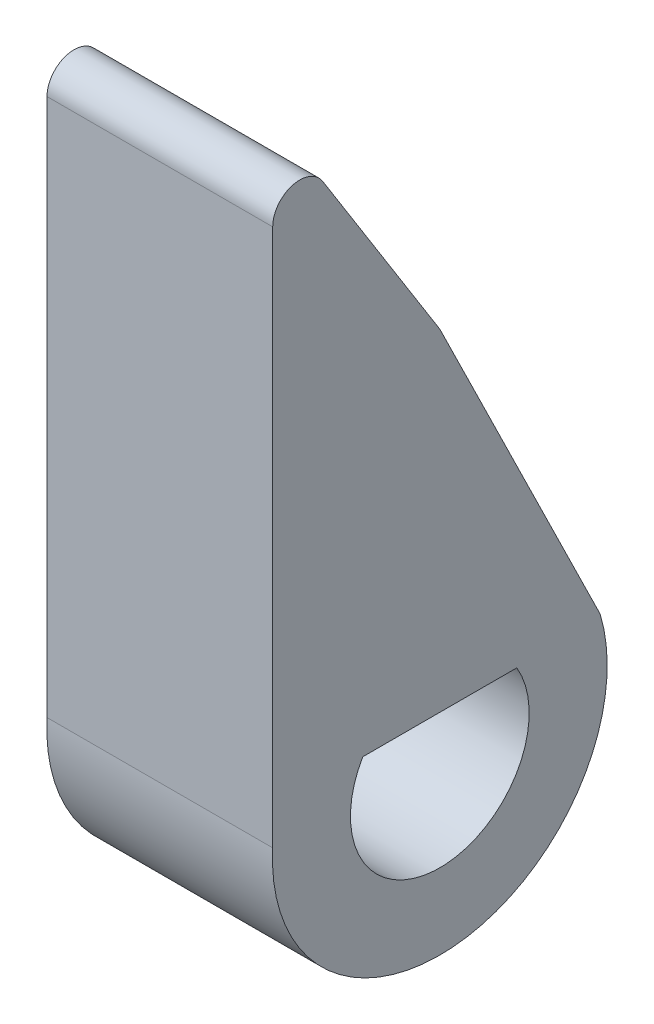
ISO-10303-21;
HEADER;
FILE_DESCRIPTION(('STEP AP214'),'2;1');
FILE_NAME('part.step','',(''),(''),'','','');
FILE_SCHEMA(('AUTOMOTIVE_DESIGN { 1 0 10303 214 1 1 1 1 }'));
ENDSEC;
DATA;
#1=APPLICATION_CONTEXT('core data for automotive mechanical design processes');
#2=APPLICATION_PROTOCOL_DEFINITION('international standard','automotive_design',2000,#1);
#3=PRODUCT_CONTEXT('',#1,'mechanical');
#4=PRODUCT('Part','Part','',(#3));
#5=PRODUCT_RELATED_PRODUCT_CATEGORY('part','',(#4));
#6=PRODUCT_DEFINITION_FORMATION('','',#4);
#7=PRODUCT_DEFINITION_CONTEXT('part definition',#1,'design');
#8=PRODUCT_DEFINITION('design','',#6,#7);
#9=PRODUCT_DEFINITION_SHAPE('','',#8);
#10=(LENGTH_UNIT() NAMED_UNIT(*) SI_UNIT(.MILLI.,.METRE.));
#11=(NAMED_UNIT(*) PLANE_ANGLE_UNIT() SI_UNIT($,.RADIAN.));
#12=(NAMED_UNIT(*) SI_UNIT($,.STERADIAN.) SOLID_ANGLE_UNIT());
#13=UNCERTAINTY_MEASURE_WITH_UNIT(LENGTH_MEASURE(1.E-05),#10,'distance_accuracy_value','');
#14=(GEOMETRIC_REPRESENTATION_CONTEXT(3) GLOBAL_UNCERTAINTY_ASSIGNED_CONTEXT((#13)) GLOBAL_UNIT_ASSIGNED_CONTEXT((#10,
#11,#12)) REPRESENTATION_CONTEXT('',''));
#15=CARTESIAN_POINT('',(0.,0.,0.));
#16=DIRECTION('',(0.,0.,1.));
#17=DIRECTION('',(1.,0.,0.));
#18=AXIS2_PLACEMENT_3D('',#15,#16,#17);
#19=CARTESIAN_POINT('',(2.5,27.5404275633658,53.6707737399797));
#20=DIRECTION('',(-1.,0.,0.));
#21=DIRECTION('',(0.,0.,1.));
#22=AXIS2_PLACEMENT_3D('',#19,#20,#21);
#23=CYLINDRICAL_SURFACE('',#22,1.85401136104677);
#24=CARTESIAN_POINT('',(2.5,27.5404275633658,53.6707737399797));
#25=DIRECTION('',(1.,0.,0.));
#26=DIRECTION('',(0.,0.,-1.));
#27=AXIS2_PLACEMENT_3D('',#24,#25,#26);
#28=CIRCLE('',#27,1.85401136104677);
#29=CARTESIAN_POINT('',(2.5,27.6417043733079,55.5220168722177));
#30=VERTEX_POINT('',#29);
#31=CARTESIAN_POINT('',(2.5,28.0710481182874,51.8943166046722));
#32=VERTEX_POINT('',#31);
#33=EDGE_CURVE('E119',#30,#32,#28,.T.);
#34=ORIENTED_EDGE('',*,*,#33,.F.);
#35=DIRECTION('',(1.,0.,0.));
#36=VECTOR('',#35,1.);
#37=CARTESIAN_POINT('',(-7.2406561259777,27.6417043733079,55.5220168722177));
#38=LINE('',#37,#36);
#39=CARTESIAN_POINT('',(0.,27.6417043733079,55.5220168722177));
#40=VERTEX_POINT('',#39);
#41=EDGE_CURVE('E131',#40,#30,#38,.T.);
#42=ORIENTED_EDGE('',*,*,#41,.F.);
#43=CARTESIAN_POINT('',(0.,27.5404275633658,53.6707737399797));
#44=DIRECTION('',(1.,0.,0.));
#45=DIRECTION('',(0.,0.,-1.));
#46=AXIS2_PLACEMENT_3D('',#43,#44,#45);
#47=CIRCLE('',#46,1.85401136104677);
#48=CARTESIAN_POINT('',(0.,28.0710481182874,51.8943166046722));
#49=VERTEX_POINT('',#48);
#50=EDGE_CURVE('E123',#40,#49,#47,.T.);
#51=ORIENTED_EDGE('',*,*,#50,.T.);
#52=DIRECTION('',(-1.,0.,0.));
#53=VECTOR('',#52,1.);
#54=CARTESIAN_POINT('',(2.5,28.0710481182874,51.8943166046722));
#55=LINE('',#54,#53);
#56=EDGE_CURVE('E106',#32,#49,#55,.T.);
#57=ORIENTED_EDGE('',*,*,#56,.F.);
#58=EDGE_LOOP('',(#34,#42,#51,#57));
#59=FACE_BOUND('',#58,.T.);
#60=ADVANCED_FACE('F41',(#59),#23,.T.);
#61=CARTESIAN_POINT('',(2.5,30.6404275633658,53.6707737399797));
#62=DIRECTION('',(1.,0.,0.));
#63=DIRECTION('',(0.,0.,-1.));
#64=AXIS2_PLACEMENT_3D('',#61,#62,#63);
#65=PLANE('',#64);
#66=DIRECTION('',(0.,0.846927219145,0.531708835239097));
#67=VECTOR('',#66,1.);
#68=CARTESIAN_POINT('',(2.5,34.6417043733079,55.5220168722177));
#69=LINE('',#68,#67);
#70=CARTESIAN_POINT('',(2.5,31.6929698516357,53.6707737399797));
#71=VERTEX_POINT('',#70);
#72=CARTESIAN_POINT('',(2.5,33.7591463847969,54.9679387064742));
#73=VERTEX_POINT('',#72);
#74=EDGE_CURVE('E128',#71,#73,#69,.T.);
#75=ORIENTED_EDGE('',*,*,#74,.T.);
#76=CARTESIAN_POINT('',(2.5,33.5996337342252,55.2220168722178));
#77=DIRECTION('',(1.,0.,0.));
#78=DIRECTION('',(0.,0.,-1.));
#79=AXIS2_PLACEMENT_3D('',#76,#77,#78);
#80=CIRCLE('',#79,0.3);
#81=CARTESIAN_POINT('',(2.5,33.5996337342252,55.5220168722177));
#82=VERTEX_POINT('',#81);
#83=EDGE_CURVE('E64',#73,#82,#80,.T.);
#84=ORIENTED_EDGE('',*,*,#83,.T.);
#85=DIRECTION('',(0.,-1.,0.));
#86=VECTOR('',#85,1.);
#87=CARTESIAN_POINT('',(2.5,27.6417043733079,55.5220168722177));
#88=LINE('',#87,#86);
#89=EDGE_CURVE('E248',#82,#30,#88,.T.);
#90=ORIENTED_EDGE('',*,*,#89,.T.);
#91=ORIENTED_EDGE('',*,*,#33,.T.);
#92=DIRECTION('',(0.,-0.897822209587444,-0.44035812695069));
#93=VECTOR('',#92,1.);
#94=CARTESIAN_POINT('',(2.5,31.6929698516357,53.6707737399797));
#95=LINE('',#94,#93);
#96=EDGE_CURVE('E112',#71,#32,#95,.T.);
#97=ORIENTED_EDGE('',*,*,#96,.F.);
#98=EDGE_LOOP('',(#75,#84,#90,#91,#97));
#99=FACE_BOUND('',#98,.T.);
#100=CARTESIAN_POINT('',(2.5,27.5141959960997,53.6707737399798));
#101=DIRECTION('',(1.,0.,0.));
#102=DIRECTION('',(0.,0.,-1.));
#103=AXIS2_PLACEMENT_3D('',#100,#101,#102);
#104=CIRCLE('',#103,0.989999999999993);
#105=CARTESIAN_POINT('',(2.5,28.0163959156241,54.5239415082585));
#106=VERTEX_POINT('',#105);
#107=CARTESIAN_POINT('',(2.5,28.0163959156241,52.8176059717011));
#108=VERTEX_POINT('',#107);
#109=EDGE_CURVE('E133',#106,#108,#104,.T.);
#110=ORIENTED_EDGE('',*,*,#109,.F.);
#111=DIRECTION('',(0.,0.,-1.));
#112=VECTOR('',#111,1.);
#113=CARTESIAN_POINT('',(2.5,28.0163959156241,54.6674353176535));
#114=LINE('',#113,#112);
#115=EDGE_CURVE('E139',#106,#108,#114,.T.);
#116=ORIENTED_EDGE('',*,*,#115,.T.);
#117=EDGE_LOOP('',(#110,#116));
#118=FACE_BOUND('',#117,.T.);
#119=ADVANCED_FACE('F195',(#99,#118),#65,.T.);
#120=CARTESIAN_POINT('',(0.,30.6404275633658,53.6707737399797));
#121=DIRECTION('',(1.,0.,0.));
#122=DIRECTION('',(0.,0.,-1.));
#123=AXIS2_PLACEMENT_3D('',#120,#121,#122);
#124=PLANE('',#123);
#125=DIRECTION('',(0.,0.,1.));
#126=VECTOR('',#125,1.);
#127=CARTESIAN_POINT('',(0.,28.2163959156241,54.5239415082585));
#128=LINE('',#127,#126);
#129=CARTESIAN_POINT('',(0.,28.2163959156241,52.7100369013919));
#130=VERTEX_POINT('',#129);
#131=CARTESIAN_POINT('',(0.,28.2163959156241,54.6315105785678));
#132=VERTEX_POINT('',#131);
#133=EDGE_CURVE('E148',#130,#132,#128,.T.);
#134=ORIENTED_EDGE('',*,*,#133,.T.);
#135=CARTESIAN_POINT('',(0.,27.5141959960997,53.6707737399798));
#136=DIRECTION('',(1.,0.,0.));
#137=DIRECTION('',(0.,0.,-1.));
#138=AXIS2_PLACEMENT_3D('',#135,#136,#137);
#139=CIRCLE('',#138,1.18999999999999);
#140=EDGE_CURVE('E151',#132,#130,#139,.T.);
#141=ORIENTED_EDGE('',*,*,#140,.T.);
#142=EDGE_LOOP('',(#134,#141));
#143=FACE_BOUND('',#142,.T.);
#144=DIRECTION('',(0.,1.,0.));
#145=VECTOR('',#144,1.);
#146=CARTESIAN_POINT('',(0.,27.6417043733079,55.5220168722177));
#147=LINE('',#146,#145);
#148=CARTESIAN_POINT('',(0.,33.5996337342252,55.5220168722177));
#149=VERTEX_POINT('',#148);
#150=EDGE_CURVE('E224',#40,#149,#147,.T.);
#151=ORIENTED_EDGE('',*,*,#150,.T.);
#152=CARTESIAN_POINT('',(0.,33.5996337342252,55.2220168722178));
#153=DIRECTION('',(1.,0.,0.));
#154=DIRECTION('',(0.,0.,-1.));
#155=AXIS2_PLACEMENT_3D('',#152,#153,#154);
#156=CIRCLE('',#155,0.3);
#157=CARTESIAN_POINT('',(0.,33.7591463847969,54.9679387064742));
#158=VERTEX_POINT('',#157);
#159=EDGE_CURVE('E11',#149,#158,#156,.F.);
#160=ORIENTED_EDGE('',*,*,#159,.T.);
#161=DIRECTION('',(0.,-0.846927219145,-0.531708835239097));
#162=VECTOR('',#161,1.);
#163=CARTESIAN_POINT('',(0.,34.6417043733079,55.5220168722177));
#164=LINE('',#163,#162);
#165=CARTESIAN_POINT('',(0.,31.6929698516357,53.6707737399797));
#166=VERTEX_POINT('',#165);
#167=EDGE_CURVE('E126',#158,#166,#164,.T.);
#168=ORIENTED_EDGE('',*,*,#167,.T.);
#169=DIRECTION('',(0.,-0.897822209587444,-0.44035812695069));
#170=VECTOR('',#169,1.);
#171=CARTESIAN_POINT('',(0.,31.6929698516357,53.6707737399797));
#172=LINE('',#171,#170);
#173=EDGE_CURVE('E109',#166,#49,#172,.T.);
#174=ORIENTED_EDGE('',*,*,#173,.T.);
#175=ORIENTED_EDGE('',*,*,#50,.F.);
#176=EDGE_LOOP('',(#151,#160,#168,#174,#175));
#177=FACE_BOUND('',#176,.T.);
#178=ADVANCED_FACE('F122',(#143,#177),#124,.F.);
#179=CARTESIAN_POINT('',(0.,27.5141959960997,53.6707737399798));
#180=DIRECTION('',(1.,0.,0.));
#181=DIRECTION('',(0.,0.,-1.));
#182=AXIS2_PLACEMENT_3D('',#179,#180,#181);
#183=CYLINDRICAL_SURFACE('',#182,0.989999999999993);
#184=DIRECTION('',(1.,0.,0.));
#185=VECTOR('',#184,1.);
#186=CARTESIAN_POINT('',(0.,28.0163959156241,52.8176059717011));
#187=LINE('',#186,#185);
#188=CARTESIAN_POINT('',(0.2,28.0163959156241,52.8176059717011));
#189=VERTEX_POINT('',#188);
#190=EDGE_CURVE('E144',#108,#189,#187,.F.);
#191=ORIENTED_EDGE('',*,*,#190,.T.);
#192=CARTESIAN_POINT('',(0.2,27.5141959960997,53.6707737399798));
#193=DIRECTION('',(1.,0.,0.));
#194=DIRECTION('',(0.,0.,-1.));
#195=AXIS2_PLACEMENT_3D('',#192,#193,#194);
#196=CIRCLE('',#195,0.989999999999993);
#197=CARTESIAN_POINT('',(0.2,28.0163959156241,54.5239415082585));
#198=VERTEX_POINT('',#197);
#199=EDGE_CURVE('E155',#189,#198,#196,.F.);
#200=ORIENTED_EDGE('',*,*,#199,.T.);
#201=DIRECTION('',(1.,0.,0.));
#202=VECTOR('',#201,1.);
#203=CARTESIAN_POINT('',(0.,28.0163959156241,54.5239415082585));
#204=LINE('',#203,#202);
#205=EDGE_CURVE('E118',#198,#106,#204,.T.);
#206=ORIENTED_EDGE('',*,*,#205,.T.);
#207=ORIENTED_EDGE('',*,*,#109,.T.);
#208=EDGE_LOOP('',(#191,#200,#206,#207));
#209=FACE_BOUND('',#208,.T.);
#210=ADVANCED_FACE('F202',(#209),#183,.F.);
#211=CARTESIAN_POINT('',(-2.16703056943876,28.0163959156241,54.6674353176535));
#212=DIRECTION('',(0.,-1.,0.));
#213=DIRECTION('',(0.,0.,-1.));
#214=AXIS2_PLACEMENT_3D('',#211,#212,#213);
#215=PLANE('',#214);
#216=ORIENTED_EDGE('',*,*,#205,.F.);
#217=DIRECTION('',(0.,0.,1.));
#218=VECTOR('',#217,1.);
#219=CARTESIAN_POINT('',(0.2,28.0163959156241,52.8176059717011));
#220=LINE('',#219,#218);
#221=EDGE_CURVE('E159',#198,#189,#220,.F.);
#222=ORIENTED_EDGE('',*,*,#221,.T.);
#223=ORIENTED_EDGE('',*,*,#190,.F.);
#224=ORIENTED_EDGE('',*,*,#115,.F.);
#225=EDGE_LOOP('',(#216,#222,#223,#224));
#226=FACE_BOUND('',#225,.T.);
#227=ADVANCED_FACE('F192',(#226),#215,.T.);
#228=CARTESIAN_POINT('',(0.2,28.2163959156241,53.6707737399797));
#229=DIRECTION('',(0.,0.,-1.));
#230=DIRECTION('',(-1.,0.,0.));
#231=AXIS2_PLACEMENT_3D('',#228,#229,#230);
#232=CYLINDRICAL_SURFACE('',#231,0.2);
#233=CARTESIAN_POINT('',(0.2,28.0163959156241,52.8176059717011));
#234=CARTESIAN_POINT('',(0.189772357512643,28.0163827461637,52.8176147868145));
#235=CARTESIAN_POINT('',(0.179557025954626,28.0171794869231,52.8171579500498));
#236=CARTESIAN_POINT('',(0.159480506417387,28.0202851473706,52.8153843990222));
#237=CARTESIAN_POINT('',(0.149617944812023,28.0225873222219,52.8140715201828));
#238=CARTESIAN_POINT('',(0.130489650722654,28.0285950089652,52.8106578234832));
#239=CARTESIAN_POINT('',(0.121223351505569,28.0322991645486,52.8085577671755));
#240=CARTESIAN_POINT('',(0.103479486426053,28.0409500335728,52.8036773085589));
#241=CARTESIAN_POINT('',(0.095002629131713,28.0458978488133,52.8008963030311));
#242=CARTESIAN_POINT('',(0.0785594278675043,28.0571575069703,52.7946044427444));
#243=CARTESIAN_POINT('',(0.0706462909463444,28.0635291111987,52.791062010407));
#244=CARTESIAN_POINT('',(0.0559907466998367,28.0772478387994,52.7834875743008));
#245=CARTESIAN_POINT('',(0.0492486860461361,28.0845952499059,52.7794554261605));
#246=CARTESIAN_POINT('',(0.036245786194352,28.1010371646158,52.7704995155165));
#247=CARTESIAN_POINT('',(0.0301494236702358,28.1102352921937,52.7655272495045));
#248=CARTESIAN_POINT('',(0.0195929108946618,28.1293738070536,52.7552723392696));
#249=CARTESIAN_POINT('',(0.0151340746689806,28.1393147827667,52.7499894497143));
#250=CARTESIAN_POINT('',(0.00785203697195295,28.1598336807001,52.7391822273171));
#251=CARTESIAN_POINT('',(0.00505106880596439,28.1704182498175,52.7336556357393));
#252=CARTESIAN_POINT('',(0.00121312094263996,28.1918603704444,52.7225601247676));
#253=CARTESIAN_POINT('',(0.000172406162618362,28.2027172942056,52.7169913202483));
#254=CARTESIAN_POINT('',(6.55167424093648E-06,28.2145249157657,52.7109872234583));
#255=CARTESIAN_POINT('',(-1.42508036722267E-08,28.2154604009842,52.710511891717));
#256=CARTESIAN_POINT('',(0.,28.2163959156241,52.7100369013919));
#257=B_SPLINE_CURVE_WITH_KNOTS('',3,(#233,#234,#235,#236,#237,#238,#239,#240,#241,#242,#243,
#244,#245,#246,#247,#248,#249,#250,#251,#252,#253,#254,#255,#256),.UNSPECIFIED.,.F.,.F.,(4,2,2,
2,2,2,2,2,2,2,2,4),(0.,0.0306224208694961,0.0611085747210697,0.0915653106350277,
0.122049124886549,0.154198674296258,0.186357724720407,0.222521484699059,0.258714201046618,
0.295381895067916,0.331971685824275,0.335119613660454),.UNSPECIFIED.);
#258=EDGE_CURVE('E163',#189,#130,#257,.T.);
#259=ORIENTED_EDGE('',*,*,#258,.F.);
#260=ORIENTED_EDGE('',*,*,#221,.F.);
#261=CARTESIAN_POINT('',(0.2,28.0163959156241,54.5239415082585));
#262=CARTESIAN_POINT('',(0.189772357512643,28.0163827461637,54.5239326931452));
#263=CARTESIAN_POINT('',(0.179557025954626,28.0171794869231,54.5243895299098));
#264=CARTESIAN_POINT('',(0.159480506417387,28.0202851473706,54.5261630809375));
#265=CARTESIAN_POINT('',(0.149617944812023,28.0225873222219,54.5274759597768));
#266=CARTESIAN_POINT('',(0.130489650722654,28.0285950089652,54.5308896564764));
#267=CARTESIAN_POINT('',(0.12122335150557,28.0322991645486,54.5329897127841));
#268=CARTESIAN_POINT('',(0.103479486426054,28.0409500335728,54.5378701714007));
#269=CARTESIAN_POINT('',(0.0950026291317135,28.0458978488133,54.5406511769286));
#270=CARTESIAN_POINT('',(0.0785594278675042,28.0571575069703,54.5469430372153));
#271=CARTESIAN_POINT('',(0.0706462909463443,28.0635291111987,54.5504854695526));
#272=CARTESIAN_POINT('',(0.0559907466998367,28.0772478387994,54.5580599056588));
#273=CARTESIAN_POINT('',(0.0492486860461361,28.0845952499059,54.5620920537992));
#274=CARTESIAN_POINT('',(0.036245786194352,28.1010371646158,54.5710479644432));
#275=CARTESIAN_POINT('',(0.0301494236702358,28.1102352921937,54.5760202304552));
#276=CARTESIAN_POINT('',(0.0195929108946617,28.1293738070536,54.5862751406901));
#277=CARTESIAN_POINT('',(0.0151340746689804,28.1393147827667,54.5915580302454));
#278=CARTESIAN_POINT('',(0.00785203697195153,28.1598336807001,54.6023652526425));
#279=CARTESIAN_POINT('',(0.00505106880596251,28.1704182498175,54.6078918442204));
#280=CARTESIAN_POINT('',(0.00121312094263952,28.1918603704444,54.6189873551921));
#281=CARTESIAN_POINT('',(0.000172406162618332,28.2027172942056,54.6245561597114));
#282=CARTESIAN_POINT('',(6.55167424093349E-06,28.2145249157657,54.6305602565014));
#283=CARTESIAN_POINT('',(-1.42508036753759E-08,28.2154604009842,54.6310355882426));
#284=CARTESIAN_POINT('',(0.,28.2163959156241,54.6315105785678));
#285=B_SPLINE_CURVE_WITH_KNOTS('',3,(#261,#262,#263,#264,#265,#266,#267,#268,#269,#270,#271,
#272,#273,#274,#275,#276,#277,#278,#279,#280,#281,#282,#283,#284),.UNSPECIFIED.,.F.,.F.,(4,2,2,
2,2,2,2,2,2,2,2,4),(0.,0.0306224208694961,0.0611085747210697,0.0915653106350264,
0.122049124886549,0.154198674296257,0.186357724720407,0.222521484699058,0.258714201046618,
0.295381895067931,0.331971685824274,0.335119613660454),.UNSPECIFIED.);
#286=EDGE_CURVE('E171',#132,#198,#285,.F.);
#287=ORIENTED_EDGE('',*,*,#286,.F.);
#288=ORIENTED_EDGE('',*,*,#133,.F.);
#289=EDGE_LOOP('',(#259,#260,#287,#288));
#290=FACE_BOUND('',#289,.T.);
#291=ADVANCED_FACE('F177',(#290),#232,.T.);
#292=CARTESIAN_POINT('',(0.2,27.5141959960997,53.6707737399798));
#293=DIRECTION('',(1.,0.,0.));
#294=DIRECTION('',(0.,0.,-1.));
#295=AXIS2_PLACEMENT_3D('',#292,#293,#294);
#296=TOROIDAL_SURFACE('',#295,1.18999999999999,0.2);
#297=ORIENTED_EDGE('',*,*,#286,.T.);
#298=ORIENTED_EDGE('',*,*,#199,.F.);
#299=ORIENTED_EDGE('',*,*,#258,.T.);
#300=ORIENTED_EDGE('',*,*,#140,.F.);
#301=EDGE_LOOP('',(#297,#298,#299,#300));
#302=FACE_BOUND('',#301,.T.);
#303=ADVANCED_FACE('F180',(#302),#296,.T.);
#304=CARTESIAN_POINT('',(-7.2406561259777,27.6417043733079,55.5220168722177));
#305=DIRECTION('',(0.,0.,1.));
#306=DIRECTION('',(1.,0.,0.));
#307=AXIS2_PLACEMENT_3D('',#304,#305,#306);
#308=PLANE('',#307);
#309=ORIENTED_EDGE('',*,*,#89,.F.);
#310=DIRECTION('',(1.,0.,0.));
#311=VECTOR('',#310,1.);
#312=CARTESIAN_POINT('',(-7.2406561259777,33.5996337342252,55.5220168722177));
#313=LINE('',#312,#311);
#314=EDGE_CURVE('E50',#82,#149,#313,.F.);
#315=ORIENTED_EDGE('',*,*,#314,.T.);
#316=ORIENTED_EDGE('',*,*,#150,.F.);
#317=ORIENTED_EDGE('',*,*,#41,.T.);
#318=EDGE_LOOP('',(#309,#315,#316,#317));
#319=FACE_BOUND('',#318,.T.);
#320=ADVANCED_FACE('F183',(#319),#308,.T.);
#321=CARTESIAN_POINT('',(-7.2406561259777,34.6417043733079,55.5220168722177));
#322=DIRECTION('',(0.,0.531708835239097,-0.846927219145));
#323=DIRECTION('',(0.,0.846927219145,0.531708835239097));
#324=AXIS2_PLACEMENT_3D('',#321,#322,#323);
#325=PLANE('',#324);
#326=ORIENTED_EDGE('',*,*,#167,.F.);
#327=DIRECTION('',(1.,0.,0.));
#328=VECTOR('',#327,1.);
#329=CARTESIAN_POINT('',(-7.2406561259777,33.7591463847969,54.9679387064742));
#330=LINE('',#329,#328);
#331=EDGE_CURVE('E162',#158,#73,#330,.T.);
#332=ORIENTED_EDGE('',*,*,#331,.T.);
#333=ORIENTED_EDGE('',*,*,#74,.F.);
#334=DIRECTION('',(1.,0.,0.));
#335=VECTOR('',#334,1.);
#336=CARTESIAN_POINT('',(-7.2406561259777,31.6929698516357,53.6707737399797));
#337=LINE('',#336,#335);
#338=EDGE_CURVE('E226',#166,#71,#337,.T.);
#339=ORIENTED_EDGE('',*,*,#338,.F.);
#340=EDGE_LOOP('',(#326,#332,#333,#339));
#341=FACE_BOUND('',#340,.T.);
#342=ADVANCED_FACE('F190',(#341),#325,.T.);
#343=CARTESIAN_POINT('',(0.,31.6929698516357,53.6707737399797));
#344=DIRECTION('',(0.,-0.44035812695069,0.897822209587444));
#345=DIRECTION('',(0.,-0.897822209587444,-0.44035812695069));
#346=AXIS2_PLACEMENT_3D('',#343,#344,#345);
#347=PLANE('',#346);
#348=ORIENTED_EDGE('',*,*,#96,.T.);
#349=ORIENTED_EDGE('',*,*,#56,.T.);
#350=ORIENTED_EDGE('',*,*,#173,.F.);
#351=ORIENTED_EDGE('',*,*,#338,.T.);
#352=EDGE_LOOP('',(#348,#349,#350,#351));
#353=FACE_BOUND('',#352,.T.);
#354=ADVANCED_FACE('F108',(#353),#347,.F.);
#355=CARTESIAN_POINT('',(-7.2406561259777,33.5996337342252,55.2220168722178));
#356=DIRECTION('',(1.,0.,0.));
#357=DIRECTION('',(0.,0.,-1.));
#358=AXIS2_PLACEMENT_3D('',#355,#356,#357);
#359=CYLINDRICAL_SURFACE('',#358,0.3);
#360=ORIENTED_EDGE('',*,*,#159,.F.);
#361=ORIENTED_EDGE('',*,*,#314,.F.);
#362=ORIENTED_EDGE('',*,*,#83,.F.);
#363=ORIENTED_EDGE('',*,*,#331,.F.);
#364=EDGE_LOOP('',(#360,#361,#362,#363));
#365=FACE_BOUND('',#364,.T.);
#366=ADVANCED_FACE('F43',(#365),#359,.T.);
#367=CLOSED_SHELL('',(#60,#119,#178,#210,#227,#291,#303,#320,#342,#354,#366));
#368=MANIFOLD_SOLID_BREP('B2',#367);
#369=ADVANCED_BREP_SHAPE_REPRESENTATION('',(#18,#368),#14);
#370=SHAPE_DEFINITION_REPRESENTATION(#9,#369);
ENDSEC;
END-ISO-10303-21;
